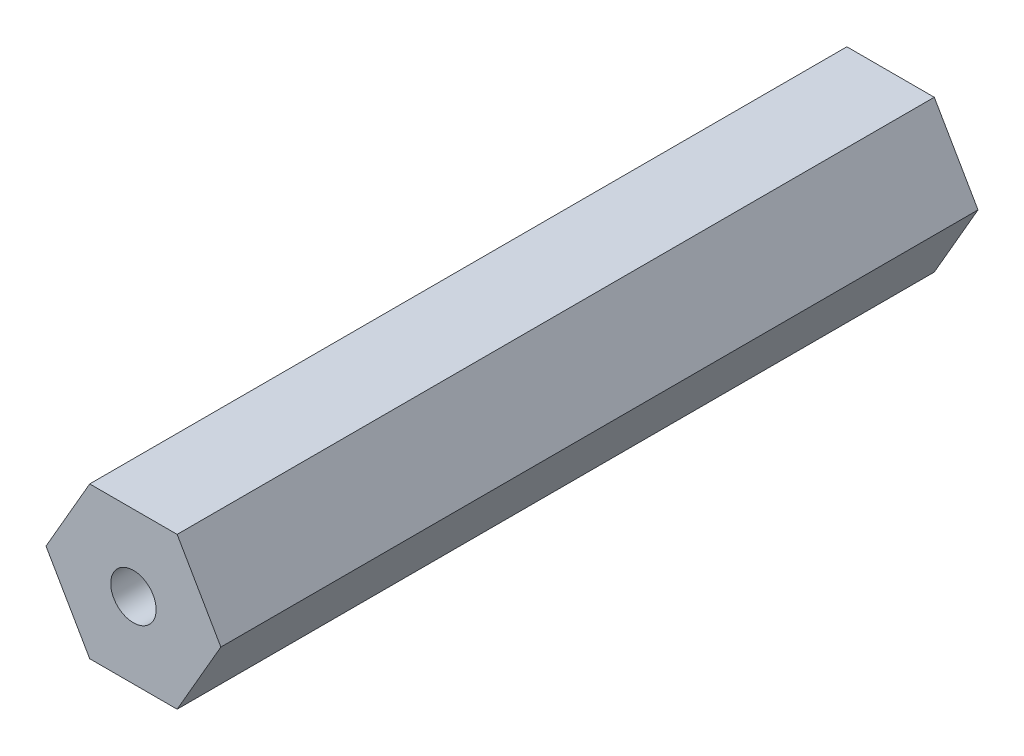
ISO-10303-21;
HEADER;
FILE_DESCRIPTION(('STEP AP214'),'2;1');
FILE_NAME('part.step','',(''),(''),'','','');
FILE_SCHEMA(('AUTOMOTIVE_DESIGN { 1 0 10303 214 1 1 1 1 }'));
ENDSEC;
DATA;
#1=APPLICATION_CONTEXT('core data for automotive mechanical design processes');
#2=APPLICATION_PROTOCOL_DEFINITION('international standard','automotive_design',2000,#1);
#3=PRODUCT_CONTEXT('',#1,'mechanical');
#4=PRODUCT('Part','Part','',(#3));
#5=PRODUCT_RELATED_PRODUCT_CATEGORY('part','',(#4));
#6=PRODUCT_DEFINITION_FORMATION('','',#4);
#7=PRODUCT_DEFINITION_CONTEXT('part definition',#1,'design');
#8=PRODUCT_DEFINITION('design','',#6,#7);
#9=PRODUCT_DEFINITION_SHAPE('','',#8);
#10=(LENGTH_UNIT() NAMED_UNIT(*) SI_UNIT(.MILLI.,.METRE.));
#11=(NAMED_UNIT(*) PLANE_ANGLE_UNIT() SI_UNIT($,.RADIAN.));
#12=(NAMED_UNIT(*) SI_UNIT($,.STERADIAN.) SOLID_ANGLE_UNIT());
#13=UNCERTAINTY_MEASURE_WITH_UNIT(LENGTH_MEASURE(1.E-05),#10,'distance_accuracy_value','');
#14=(GEOMETRIC_REPRESENTATION_CONTEXT(3) GLOBAL_UNCERTAINTY_ASSIGNED_CONTEXT((#13)) GLOBAL_UNIT_ASSIGNED_CONTEXT((#10,
#11,#12)) REPRESENTATION_CONTEXT('',''));
#15=CARTESIAN_POINT('',(0.,0.,0.));
#16=DIRECTION('',(0.,0.,1.));
#17=DIRECTION('',(1.,0.,0.));
#18=AXIS2_PLACEMENT_3D('',#15,#16,#17);
#19=CARTESIAN_POINT('',(0.,0.,50.));
#20=DIRECTION('',(0.,0.,1.));
#21=DIRECTION('',(1.,0.,0.));
#22=AXIS2_PLACEMENT_3D('',#19,#20,#21);
#23=PLANE('',#22);
#24=DIRECTION('',(0.5,0.866025403784439,0.));
#25=VECTOR('',#24,1.);
#26=CARTESIAN_POINT('',(2.88675134594813,-5.,50.));
#27=LINE('',#26,#25);
#28=CARTESIAN_POINT('',(2.88675134594813,-5.,50.));
#29=VERTEX_POINT('',#28);
#30=CARTESIAN_POINT('',(5.77350269189626,0.,50.));
#31=VERTEX_POINT('',#30);
#32=EDGE_CURVE('E129',#29,#31,#27,.T.);
#33=ORIENTED_EDGE('',*,*,#32,.T.);
#34=DIRECTION('',(-0.5,0.866025403784438,0.));
#35=VECTOR('',#34,1.);
#36=CARTESIAN_POINT('',(5.77350269189626,0.,50.));
#37=LINE('',#36,#35);
#38=CARTESIAN_POINT('',(2.88675134594812,5.00000000000001,50.));
#39=VERTEX_POINT('',#38);
#40=EDGE_CURVE('E87',#31,#39,#37,.T.);
#41=ORIENTED_EDGE('',*,*,#40,.T.);
#42=DIRECTION('',(-1.,0.,0.));
#43=VECTOR('',#42,1.);
#44=CARTESIAN_POINT('',(2.88675134594812,5.00000000000001,50.));
#45=LINE('',#44,#43);
#46=CARTESIAN_POINT('',(-2.88675134594813,5.,50.));
#47=VERTEX_POINT('',#46);
#48=EDGE_CURVE('E100',#39,#47,#45,.T.);
#49=ORIENTED_EDGE('',*,*,#48,.T.);
#50=DIRECTION('',(-0.5,-0.866025403784439,0.));
#51=VECTOR('',#50,1.);
#52=CARTESIAN_POINT('',(-2.88675134594813,5.,50.));
#53=LINE('',#52,#51);
#54=CARTESIAN_POINT('',(-5.77350269189626,0.,50.));
#55=VERTEX_POINT('',#54);
#56=EDGE_CURVE('E94',#47,#55,#53,.T.);
#57=ORIENTED_EDGE('',*,*,#56,.T.);
#58=DIRECTION('',(0.5,-0.866025403784439,0.));
#59=VECTOR('',#58,1.);
#60=CARTESIAN_POINT('',(-5.77350269189626,0.,50.));
#61=LINE('',#60,#59);
#62=CARTESIAN_POINT('',(-2.88675134594813,-5.,50.));
#63=VERTEX_POINT('',#62);
#64=EDGE_CURVE('E98',#55,#63,#61,.T.);
#65=ORIENTED_EDGE('',*,*,#64,.T.);
#66=DIRECTION('',(1.,0.,0.));
#67=VECTOR('',#66,1.);
#68=CARTESIAN_POINT('',(-2.88675134594813,-5.,50.));
#69=LINE('',#68,#67);
#70=EDGE_CURVE('E50',#63,#29,#69,.T.);
#71=ORIENTED_EDGE('',*,*,#70,.T.);
#72=EDGE_LOOP('',(#33,#41,#49,#57,#65,#71));
#73=FACE_BOUND('',#72,.T.);
#74=CARTESIAN_POINT('',(0.,0.,50.));
#75=DIRECTION('',(0.,0.,1.));
#76=DIRECTION('',(1.,0.,0.));
#77=AXIS2_PLACEMENT_3D('',#74,#75,#76);
#78=CIRCLE('',#77,1.5);
#79=CARTESIAN_POINT('',(1.5,0.,50.));
#80=VERTEX_POINT('',#79);
#81=EDGE_CURVE('E122',#80,#80,#78,.T.);
#82=ORIENTED_EDGE('',*,*,#81,.F.);
#83=EDGE_LOOP('',(#82));
#84=FACE_BOUND('',#83,.T.);
#85=ADVANCED_FACE('F33',(#73,#84),#23,.T.);
#86=CARTESIAN_POINT('',(0.,0.,0.));
#87=DIRECTION('',(0.,0.,1.));
#88=DIRECTION('',(1.,0.,0.));
#89=AXIS2_PLACEMENT_3D('',#86,#87,#88);
#90=PLANE('',#89);
#91=DIRECTION('',(0.5,0.866025403784439,0.));
#92=VECTOR('',#91,1.);
#93=CARTESIAN_POINT('',(2.88675134594813,-5.,0.));
#94=LINE('',#93,#92);
#95=CARTESIAN_POINT('',(2.88675134594813,-5.,0.));
#96=VERTEX_POINT('',#95);
#97=CARTESIAN_POINT('',(5.77350269189626,0.,0.));
#98=VERTEX_POINT('',#97);
#99=EDGE_CURVE('E118',#96,#98,#94,.T.);
#100=ORIENTED_EDGE('',*,*,#99,.F.);
#101=DIRECTION('',(1.,0.,0.));
#102=VECTOR('',#101,1.);
#103=CARTESIAN_POINT('',(-2.88675134594813,-5.,0.));
#104=LINE('',#103,#102);
#105=CARTESIAN_POINT('',(-2.88675134594813,-5.,0.));
#106=VERTEX_POINT('',#105);
#107=EDGE_CURVE('E79',#106,#96,#104,.T.);
#108=ORIENTED_EDGE('',*,*,#107,.F.);
#109=DIRECTION('',(0.5,-0.866025403784439,0.));
#110=VECTOR('',#109,1.);
#111=CARTESIAN_POINT('',(-5.77350269189626,0.,0.));
#112=LINE('',#111,#110);
#113=CARTESIAN_POINT('',(-5.77350269189626,0.,0.));
#114=VERTEX_POINT('',#113);
#115=EDGE_CURVE('E73',#114,#106,#112,.T.);
#116=ORIENTED_EDGE('',*,*,#115,.F.);
#117=DIRECTION('',(-0.5,-0.866025403784439,0.));
#118=VECTOR('',#117,1.);
#119=CARTESIAN_POINT('',(-2.88675134594813,5.,0.));
#120=LINE('',#119,#118);
#121=CARTESIAN_POINT('',(-2.88675134594813,5.,0.));
#122=VERTEX_POINT('',#121);
#123=EDGE_CURVE('E108',#122,#114,#120,.T.);
#124=ORIENTED_EDGE('',*,*,#123,.F.);
#125=DIRECTION('',(-1.,0.,0.));
#126=VECTOR('',#125,1.);
#127=CARTESIAN_POINT('',(2.88675134594812,5.00000000000001,0.));
#128=LINE('',#127,#126);
#129=CARTESIAN_POINT('',(2.88675134594812,5.00000000000001,0.));
#130=VERTEX_POINT('',#129);
#131=EDGE_CURVE('E124',#130,#122,#128,.T.);
#132=ORIENTED_EDGE('',*,*,#131,.F.);
#133=DIRECTION('',(-0.5,0.866025403784438,0.));
#134=VECTOR('',#133,1.);
#135=CARTESIAN_POINT('',(5.77350269189626,0.,0.));
#136=LINE('',#135,#134);
#137=EDGE_CURVE('E121',#98,#130,#136,.T.);
#138=ORIENTED_EDGE('',*,*,#137,.F.);
#139=EDGE_LOOP('',(#100,#108,#116,#124,#132,#138));
#140=FACE_BOUND('',#139,.T.);
#141=CARTESIAN_POINT('',(0.,0.,0.));
#142=DIRECTION('',(0.,0.,1.));
#143=DIRECTION('',(1.,0.,0.));
#144=AXIS2_PLACEMENT_3D('',#141,#142,#143);
#145=CIRCLE('',#144,1.5);
#146=CARTESIAN_POINT('',(1.5,0.,0.));
#147=VERTEX_POINT('',#146);
#148=EDGE_CURVE('E222',#147,#147,#145,.T.);
#149=ORIENTED_EDGE('',*,*,#148,.T.);
#150=EDGE_LOOP('',(#149));
#151=FACE_BOUND('',#150,.T.);
#152=ADVANCED_FACE('F138',(#140,#151),#90,.F.);
#153=CARTESIAN_POINT('',(2.88675134594813,-5.,50.));
#154=DIRECTION('',(-0.866025403784439,0.5,0.));
#155=DIRECTION('',(-0.5,-0.866025403784439,0.));
#156=AXIS2_PLACEMENT_3D('',#153,#154,#155);
#157=PLANE('',#156);
#158=ORIENTED_EDGE('',*,*,#99,.T.);
#159=DIRECTION('',(0.,0.,-1.));
#160=VECTOR('',#159,1.);
#161=CARTESIAN_POINT('',(5.77350269189626,0.,50.));
#162=LINE('',#161,#160);
#163=EDGE_CURVE('E11',#31,#98,#162,.T.);
#164=ORIENTED_EDGE('',*,*,#163,.F.);
#165=ORIENTED_EDGE('',*,*,#32,.F.);
#166=DIRECTION('',(0.,0.,-1.));
#167=VECTOR('',#166,1.);
#168=CARTESIAN_POINT('',(2.88675134594813,-5.,50.));
#169=LINE('',#168,#167);
#170=EDGE_CURVE('E114',#29,#96,#169,.T.);
#171=ORIENTED_EDGE('',*,*,#170,.T.);
#172=EDGE_LOOP('',(#158,#164,#165,#171));
#173=FACE_BOUND('',#172,.T.);
#174=ADVANCED_FACE('F35',(#173),#157,.F.);
#175=CARTESIAN_POINT('',(5.77350269189626,0.,50.));
#176=DIRECTION('',(-0.866025403784438,-0.5,0.));
#177=DIRECTION('',(0.5,-0.866025403784439,0.));
#178=AXIS2_PLACEMENT_3D('',#175,#176,#177);
#179=PLANE('',#178);
#180=ORIENTED_EDGE('',*,*,#137,.T.);
#181=DIRECTION('',(0.,0.,-1.));
#182=VECTOR('',#181,1.);
#183=CARTESIAN_POINT('',(2.88675134594812,5.00000000000001,50.));
#184=LINE('',#183,#182);
#185=EDGE_CURVE('E42',#39,#130,#184,.T.);
#186=ORIENTED_EDGE('',*,*,#185,.F.);
#187=ORIENTED_EDGE('',*,*,#40,.F.);
#188=ORIENTED_EDGE('',*,*,#163,.T.);
#189=EDGE_LOOP('',(#180,#186,#187,#188));
#190=FACE_BOUND('',#189,.T.);
#191=ADVANCED_FACE('F163',(#190),#179,.F.);
#192=CARTESIAN_POINT('',(2.88675134594812,5.00000000000001,50.));
#193=DIRECTION('',(0.,-1.,0.));
#194=DIRECTION('',(1.,0.,0.));
#195=AXIS2_PLACEMENT_3D('',#192,#193,#194);
#196=PLANE('',#195);
#197=ORIENTED_EDGE('',*,*,#131,.T.);
#198=DIRECTION('',(0.,0.,-1.));
#199=VECTOR('',#198,1.);
#200=CARTESIAN_POINT('',(-2.88675134594813,5.,50.));
#201=LINE('',#200,#199);
#202=EDGE_CURVE('E109',#47,#122,#201,.T.);
#203=ORIENTED_EDGE('',*,*,#202,.F.);
#204=ORIENTED_EDGE('',*,*,#48,.F.);
#205=ORIENTED_EDGE('',*,*,#185,.T.);
#206=EDGE_LOOP('',(#197,#203,#204,#205));
#207=FACE_BOUND('',#206,.T.);
#208=ADVANCED_FACE('F135',(#207),#196,.F.);
#209=CARTESIAN_POINT('',(-2.88675134594813,5.,50.));
#210=DIRECTION('',(0.866025403784439,-0.5,0.));
#211=DIRECTION('',(0.5,0.866025403784439,0.));
#212=AXIS2_PLACEMENT_3D('',#209,#210,#211);
#213=PLANE('',#212);
#214=ORIENTED_EDGE('',*,*,#123,.T.);
#215=DIRECTION('',(0.,0.,-1.));
#216=VECTOR('',#215,1.);
#217=CARTESIAN_POINT('',(-5.77350269189626,0.,50.));
#218=LINE('',#217,#216);
#219=EDGE_CURVE('E105',#55,#114,#218,.T.);
#220=ORIENTED_EDGE('',*,*,#219,.F.);
#221=ORIENTED_EDGE('',*,*,#56,.F.);
#222=ORIENTED_EDGE('',*,*,#202,.T.);
#223=EDGE_LOOP('',(#214,#220,#221,#222));
#224=FACE_BOUND('',#223,.T.);
#225=ADVANCED_FACE('F106',(#224),#213,.F.);
#226=CARTESIAN_POINT('',(-5.77350269189626,0.,50.));
#227=DIRECTION('',(0.866025403784439,0.5,0.));
#228=DIRECTION('',(-0.5,0.866025403784439,0.));
#229=AXIS2_PLACEMENT_3D('',#226,#227,#228);
#230=PLANE('',#229);
#231=ORIENTED_EDGE('',*,*,#115,.T.);
#232=DIRECTION('',(0.,0.,-1.));
#233=VECTOR('',#232,1.);
#234=CARTESIAN_POINT('',(-2.88675134594813,-5.,50.));
#235=LINE('',#234,#233);
#236=EDGE_CURVE('E110',#63,#106,#235,.T.);
#237=ORIENTED_EDGE('',*,*,#236,.F.);
#238=ORIENTED_EDGE('',*,*,#64,.F.);
#239=ORIENTED_EDGE('',*,*,#219,.T.);
#240=EDGE_LOOP('',(#231,#237,#238,#239));
#241=FACE_BOUND('',#240,.T.);
#242=ADVANCED_FACE('F112',(#241),#230,.F.);
#243=CARTESIAN_POINT('',(-2.88675134594813,-5.,50.));
#244=DIRECTION('',(0.,1.,0.));
#245=DIRECTION('',(0.,0.,1.));
#246=AXIS2_PLACEMENT_3D('',#243,#244,#245);
#247=PLANE('',#246);
#248=ORIENTED_EDGE('',*,*,#107,.T.);
#249=ORIENTED_EDGE('',*,*,#170,.F.);
#250=ORIENTED_EDGE('',*,*,#70,.F.);
#251=ORIENTED_EDGE('',*,*,#236,.T.);
#252=EDGE_LOOP('',(#248,#249,#250,#251));
#253=FACE_BOUND('',#252,.T.);
#254=ADVANCED_FACE('F143',(#253),#247,.F.);
#255=CARTESIAN_POINT('',(0.,0.,50.));
#256=DIRECTION('',(0.,0.,-1.));
#257=DIRECTION('',(-1.,0.,0.));
#258=AXIS2_PLACEMENT_3D('',#255,#256,#257);
#259=CYLINDRICAL_SURFACE('',#258,1.5);
#260=ORIENTED_EDGE('',*,*,#81,.T.);
#261=EDGE_LOOP('',(#260));
#262=FACE_BOUND('',#261,.T.);
#263=ORIENTED_EDGE('',*,*,#148,.F.);
#264=EDGE_LOOP('',(#263));
#265=FACE_BOUND('',#264,.T.);
#266=ADVANCED_FACE('F145',(#262,#265),#259,.F.);
#267=CLOSED_SHELL('',(#85,#152,#174,#191,#208,#225,#242,#254,#266));
#268=MANIFOLD_SOLID_BREP('B2',#267);
#269=ADVANCED_BREP_SHAPE_REPRESENTATION('',(#18,#268),#14);
#270=SHAPE_DEFINITION_REPRESENTATION(#9,#269);
ENDSEC;
END-ISO-10303-21;
